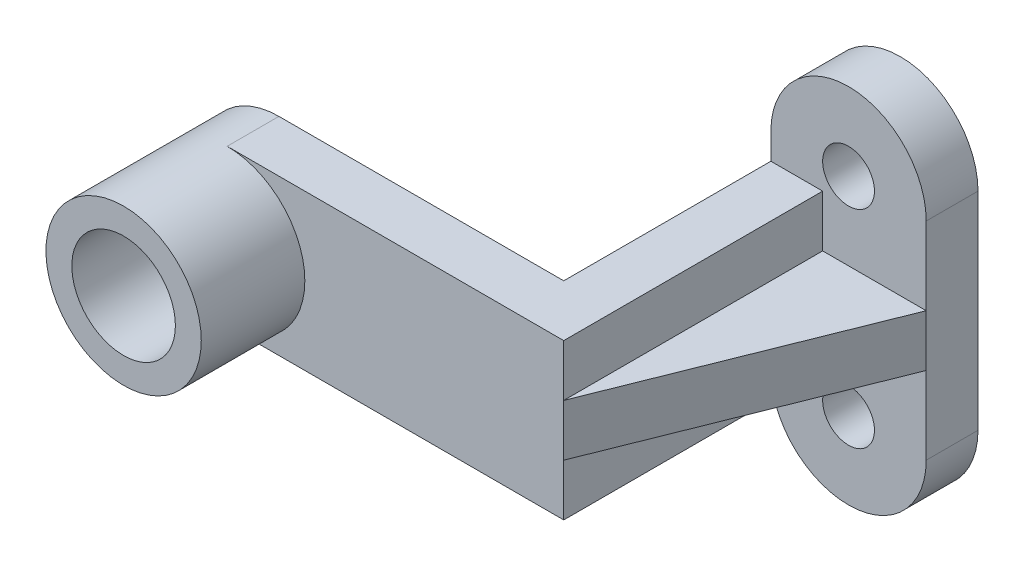
ISO-10303-21;
HEADER;
FILE_DESCRIPTION(('STEP AP214'),'2;1');
FILE_NAME('part.step','',(''),(''),'','','');
FILE_SCHEMA(('AUTOMOTIVE_DESIGN { 1 0 10303 214 1 1 1 1 }'));
ENDSEC;
DATA;
#1=APPLICATION_CONTEXT('core data for automotive mechanical design processes');
#2=APPLICATION_PROTOCOL_DEFINITION('international standard','automotive_design',2000,#1);
#3=PRODUCT_CONTEXT('',#1,'mechanical');
#4=PRODUCT('Part','Part','',(#3));
#5=PRODUCT_RELATED_PRODUCT_CATEGORY('part','',(#4));
#6=PRODUCT_DEFINITION_FORMATION('','',#4);
#7=PRODUCT_DEFINITION_CONTEXT('part definition',#1,'design');
#8=PRODUCT_DEFINITION('design','',#6,#7);
#9=PRODUCT_DEFINITION_SHAPE('','',#8);
#10=(LENGTH_UNIT() NAMED_UNIT(*) SI_UNIT(.MILLI.,.METRE.));
#11=(NAMED_UNIT(*) PLANE_ANGLE_UNIT() SI_UNIT($,.RADIAN.));
#12=(NAMED_UNIT(*) SI_UNIT($,.STERADIAN.) SOLID_ANGLE_UNIT());
#13=UNCERTAINTY_MEASURE_WITH_UNIT(LENGTH_MEASURE(1.E-05),#10,'distance_accuracy_value','');
#14=(GEOMETRIC_REPRESENTATION_CONTEXT(3) GLOBAL_UNCERTAINTY_ASSIGNED_CONTEXT((#13)) GLOBAL_UNIT_ASSIGNED_CONTEXT((#10,
#11,#12)) REPRESENTATION_CONTEXT('',''));
#15=CARTESIAN_POINT('',(0.,0.,0.));
#16=DIRECTION('',(0.,0.,1.));
#17=DIRECTION('',(1.,0.,0.));
#18=AXIS2_PLACEMENT_3D('',#15,#16,#17);
#19=CARTESIAN_POINT('',(0.,0.,60.));
#20=DIRECTION('',(0.,0.,-1.));
#21=DIRECTION('',(-1.,0.,0.));
#22=AXIS2_PLACEMENT_3D('',#19,#20,#21);
#23=PLANE('',#22);
#24=CARTESIAN_POINT('',(-70.,0.,60.));
#25=DIRECTION('',(0.,0.,1.));
#26=DIRECTION('',(1.,0.,0.));
#27=AXIS2_PLACEMENT_3D('',#24,#25,#26);
#28=CIRCLE('',#27,10.);
#29=CARTESIAN_POINT('',(-60.,0.,60.));
#30=VERTEX_POINT('',#29);
#31=EDGE_CURVE('E43',#30,#30,#28,.T.);
#32=ORIENTED_EDGE('',*,*,#31,.T.);
#33=EDGE_LOOP('',(#32));
#34=FACE_BOUND('',#33,.T.);
#35=ADVANCED_FACE('F33',(#34),#23,.F.);
#36=CARTESIAN_POINT('',(-15.,20.,10.));
#37=DIRECTION('',(1.,0.,0.));
#38=DIRECTION('',(0.,1.,0.));
#39=AXIS2_PLACEMENT_3D('',#36,#37,#38);
#40=PLANE('',#39);
#41=DIRECTION('',(0.,-1.,0.));
#42=VECTOR('',#41,1.);
#43=CARTESIAN_POINT('',(-15.,15.,50.));
#44=LINE('',#43,#42);
#45=CARTESIAN_POINT('',(-15.,15.,50.));
#46=VERTEX_POINT('',#45);
#47=CARTESIAN_POINT('',(-15.,-15.,50.));
#48=VERTEX_POINT('',#47);
#49=EDGE_CURVE('E165',#46,#48,#44,.T.);
#50=ORIENTED_EDGE('',*,*,#49,.F.);
#51=DIRECTION('',(0.,0.,-1.));
#52=VECTOR('',#51,1.);
#53=CARTESIAN_POINT('',(-15.,15.,60.));
#54=LINE('',#53,#52);
#55=CARTESIAN_POINT('',(-15.,15.,10.));
#56=VERTEX_POINT('',#55);
#57=EDGE_CURVE('E157',#46,#56,#54,.T.);
#58=ORIENTED_EDGE('',*,*,#57,.T.);
#59=DIRECTION('',(0.,-1.,0.));
#60=VECTOR('',#59,1.);
#61=CARTESIAN_POINT('',(-15.,20.,10.));
#62=LINE('',#61,#60);
#63=CARTESIAN_POINT('',(-15.,20.,10.));
#64=VERTEX_POINT('',#63);
#65=EDGE_CURVE('E85',#64,#56,#62,.T.);
#66=ORIENTED_EDGE('',*,*,#65,.F.);
#67=DIRECTION('',(0.,0.,-1.));
#68=VECTOR('',#67,1.);
#69=CARTESIAN_POINT('',(-15.,20.,10.));
#70=LINE('',#69,#68);
#71=CARTESIAN_POINT('',(-15.,20.,0.));
#72=VERTEX_POINT('',#71);
#73=EDGE_CURVE('E37',#64,#72,#70,.T.);
#74=ORIENTED_EDGE('',*,*,#73,.T.);
#75=DIRECTION('',(0.,-1.,0.));
#76=VECTOR('',#75,1.);
#77=CARTESIAN_POINT('',(-15.,20.,0.));
#78=LINE('',#77,#76);
#79=CARTESIAN_POINT('',(-15.,-20.,0.));
#80=VERTEX_POINT('',#79);
#81=EDGE_CURVE('E241',#72,#80,#78,.T.);
#82=ORIENTED_EDGE('',*,*,#81,.T.);
#83=DIRECTION('',(0.,0.,-1.));
#84=VECTOR('',#83,1.);
#85=CARTESIAN_POINT('',(-15.,-20.,10.));
#86=LINE('',#85,#84);
#87=CARTESIAN_POINT('',(-15.,-20.,10.));
#88=VERTEX_POINT('',#87);
#89=EDGE_CURVE('E247',#88,#80,#86,.T.);
#90=ORIENTED_EDGE('',*,*,#89,.F.);
#91=CARTESIAN_POINT('',(-15.,-15.,10.));
#92=VERTEX_POINT('',#91);
#93=EDGE_CURVE('E231',#92,#88,#62,.T.);
#94=ORIENTED_EDGE('',*,*,#93,.F.);
#95=DIRECTION('',(0.,0.,-1.));
#96=VECTOR('',#95,1.);
#97=CARTESIAN_POINT('',(-15.,-15.,60.));
#98=LINE('',#97,#96);
#99=EDGE_CURVE('E192',#48,#92,#98,.T.);
#100=ORIENTED_EDGE('',*,*,#99,.F.);
#101=EDGE_LOOP('',(#50,#58,#66,#74,#82,#90,#94,#100));
#102=FACE_BOUND('',#101,.T.);
#103=ADVANCED_FACE('F304',(#102),#40,.F.);
#104=CARTESIAN_POINT('',(0.,20.,10.));
#105=DIRECTION('',(0.,0.,1.));
#106=DIRECTION('',(1.,0.,0.));
#107=AXIS2_PLACEMENT_3D('',#104,#105,#106);
#108=PLANE('',#107);
#109=CARTESIAN_POINT('',(0.,-20.,10.));
#110=DIRECTION('',(0.,0.,1.));
#111=DIRECTION('',(1.,0.,0.));
#112=AXIS2_PLACEMENT_3D('',#109,#110,#111);
#113=CIRCLE('',#112,5.);
#114=CARTESIAN_POINT('',(5.00000000000001,-20.,10.));
#115=VERTEX_POINT('',#114);
#116=EDGE_CURVE('E223',#115,#115,#113,.T.);
#117=ORIENTED_EDGE('',*,*,#116,.F.);
#118=EDGE_LOOP('',(#117));
#119=FACE_BOUND('',#118,.T.);
#120=DIRECTION('',(0.,1.,0.));
#121=VECTOR('',#120,1.);
#122=CARTESIAN_POINT('',(-5.00000000000001,-15.,10.));
#123=LINE('',#122,#121);
#124=CARTESIAN_POINT('',(-5.00000000000001,-15.,10.));
#125=VERTEX_POINT('',#124);
#126=CARTESIAN_POINT('',(-5.00000000000001,-5.,10.));
#127=VERTEX_POINT('',#126);
#128=EDGE_CURVE('E183',#125,#127,#123,.T.);
#129=ORIENTED_EDGE('',*,*,#128,.F.);
#130=DIRECTION('',(1.,0.,0.));
#131=VECTOR('',#130,1.);
#132=CARTESIAN_POINT('',(-15.,-15.,10.));
#133=LINE('',#132,#131);
#134=EDGE_CURVE('E176',#92,#125,#133,.T.);
#135=ORIENTED_EDGE('',*,*,#134,.F.);
#136=ORIENTED_EDGE('',*,*,#93,.T.);
#137=CARTESIAN_POINT('',(0.,-20.,10.));
#138=DIRECTION('',(0.,0.,1.));
#139=DIRECTION('',(1.,0.,0.));
#140=AXIS2_PLACEMENT_3D('',#137,#138,#139);
#141=CIRCLE('',#140,15.);
#142=CARTESIAN_POINT('',(15.,-20.,10.));
#143=VERTEX_POINT('',#142);
#144=EDGE_CURVE('E233',#88,#143,#141,.T.);
#145=ORIENTED_EDGE('',*,*,#144,.T.);
#146=DIRECTION('',(0.,1.,0.));
#147=VECTOR('',#146,1.);
#148=CARTESIAN_POINT('',(15.,20.,10.));
#149=LINE('',#148,#147);
#150=CARTESIAN_POINT('',(15.,-5.,10.));
#151=VERTEX_POINT('',#150);
#152=EDGE_CURVE('E235',#143,#151,#149,.T.);
#153=ORIENTED_EDGE('',*,*,#152,.T.);
#154=DIRECTION('',(1.,0.,0.));
#155=VECTOR('',#154,1.);
#156=CARTESIAN_POINT('',(15.,-5.,10.));
#157=LINE('',#156,#155);
#158=EDGE_CURVE('E207',#127,#151,#157,.T.);
#159=ORIENTED_EDGE('',*,*,#158,.F.);
#160=EDGE_LOOP('',(#129,#135,#136,#145,#153,#159));
#161=FACE_BOUND('',#160,.T.);
#162=ADVANCED_FACE('F287',(#119,#161),#108,.T.);
#163=CARTESIAN_POINT('',(0.,20.,10.));
#164=DIRECTION('',(0.,0.,1.));
#165=DIRECTION('',(1.,0.,0.));
#166=AXIS2_PLACEMENT_3D('',#163,#164,#165);
#167=CIRCLE('',#166,5.);
#168=CARTESIAN_POINT('',(4.99999999999999,20.,10.));
#169=VERTEX_POINT('',#168);
#170=EDGE_CURVE('E217',#169,#169,#167,.T.);
#171=ORIENTED_EDGE('',*,*,#170,.F.);
#172=EDGE_LOOP('',(#171));
#173=FACE_BOUND('',#172,.T.);
#174=DIRECTION('',(-1.,0.,0.));
#175=VECTOR('',#174,1.);
#176=CARTESIAN_POINT('',(-15.,15.,10.));
#177=LINE('',#176,#175);
#178=CARTESIAN_POINT('',(-5.00000000000001,15.,10.));
#179=VERTEX_POINT('',#178);
#180=EDGE_CURVE('E179',#179,#56,#177,.T.);
#181=ORIENTED_EDGE('',*,*,#180,.F.);
#182=CARTESIAN_POINT('',(-5.00000000000001,4.99999999999999,10.));
#183=VERTEX_POINT('',#182);
#184=EDGE_CURVE('E182',#183,#179,#123,.T.);
#185=ORIENTED_EDGE('',*,*,#184,.F.);
#186=DIRECTION('',(-1.,0.,0.));
#187=VECTOR('',#186,1.);
#188=CARTESIAN_POINT('',(15.,5.,10.));
#189=LINE('',#188,#187);
#190=CARTESIAN_POINT('',(15.,5.,10.));
#191=VERTEX_POINT('',#190);
#192=EDGE_CURVE('E202',#191,#183,#189,.T.);
#193=ORIENTED_EDGE('',*,*,#192,.F.);
#194=CARTESIAN_POINT('',(15.,20.,10.));
#195=VERTEX_POINT('',#194);
#196=EDGE_CURVE('E52',#191,#195,#149,.T.);
#197=ORIENTED_EDGE('',*,*,#196,.T.);
#198=CARTESIAN_POINT('',(0.,20.,10.));
#199=DIRECTION('',(0.,0.,1.));
#200=DIRECTION('',(1.,0.,0.));
#201=AXIS2_PLACEMENT_3D('',#198,#199,#200);
#202=CIRCLE('',#201,15.);
#203=EDGE_CURVE('E229',#195,#64,#202,.T.);
#204=ORIENTED_EDGE('',*,*,#203,.T.);
#205=ORIENTED_EDGE('',*,*,#65,.T.);
#206=EDGE_LOOP('',(#181,#185,#193,#197,#204,#205));
#207=FACE_BOUND('',#206,.T.);
#208=ADVANCED_FACE('F295',(#173,#207),#108,.T.);
#209=CARTESIAN_POINT('',(0.,20.,0.));
#210=DIRECTION('',(0.,0.,1.));
#211=DIRECTION('',(1.,0.,0.));
#212=AXIS2_PLACEMENT_3D('',#209,#210,#211);
#213=PLANE('',#212);
#214=CARTESIAN_POINT('',(0.,20.,0.));
#215=DIRECTION('',(0.,0.,1.));
#216=DIRECTION('',(1.,0.,0.));
#217=AXIS2_PLACEMENT_3D('',#214,#215,#216);
#218=CIRCLE('',#217,15.);
#219=CARTESIAN_POINT('',(15.,20.,0.));
#220=VERTEX_POINT('',#219);
#221=EDGE_CURVE('E226',#220,#72,#218,.T.);
#222=ORIENTED_EDGE('',*,*,#221,.F.);
#223=DIRECTION('',(0.,1.,0.));
#224=VECTOR('',#223,1.);
#225=CARTESIAN_POINT('',(15.,20.,0.));
#226=LINE('',#225,#224);
#227=CARTESIAN_POINT('',(15.,-20.,0.));
#228=VERTEX_POINT('',#227);
#229=EDGE_CURVE('E77',#228,#220,#226,.T.);
#230=ORIENTED_EDGE('',*,*,#229,.F.);
#231=CARTESIAN_POINT('',(0.,-20.,0.));
#232=DIRECTION('',(0.,0.,1.));
#233=DIRECTION('',(1.,0.,0.));
#234=AXIS2_PLACEMENT_3D('',#231,#232,#233);
#235=CIRCLE('',#234,15.);
#236=EDGE_CURVE('E71',#80,#228,#235,.T.);
#237=ORIENTED_EDGE('',*,*,#236,.F.);
#238=ORIENTED_EDGE('',*,*,#81,.F.);
#239=EDGE_LOOP('',(#222,#230,#237,#238));
#240=FACE_BOUND('',#239,.T.);
#241=CARTESIAN_POINT('',(0.,-20.,0.));
#242=DIRECTION('',(0.,0.,1.));
#243=DIRECTION('',(1.,0.,0.));
#244=AXIS2_PLACEMENT_3D('',#241,#242,#243);
#245=CIRCLE('',#244,5.);
#246=CARTESIAN_POINT('',(5.00000000000001,-20.,0.));
#247=VERTEX_POINT('',#246);
#248=EDGE_CURVE('E220',#247,#247,#245,.T.);
#249=ORIENTED_EDGE('',*,*,#248,.T.);
#250=EDGE_LOOP('',(#249));
#251=FACE_BOUND('',#250,.T.);
#252=CARTESIAN_POINT('',(0.,20.,0.));
#253=DIRECTION('',(0.,0.,1.));
#254=DIRECTION('',(1.,0.,0.));
#255=AXIS2_PLACEMENT_3D('',#252,#253,#254);
#256=CIRCLE('',#255,5.);
#257=CARTESIAN_POINT('',(4.99999999999999,20.,0.));
#258=VERTEX_POINT('',#257);
#259=EDGE_CURVE('E216',#258,#258,#256,.T.);
#260=ORIENTED_EDGE('',*,*,#259,.T.);
#261=EDGE_LOOP('',(#260));
#262=FACE_BOUND('',#261,.T.);
#263=ADVANCED_FACE('F302',(#240,#251,#262),#213,.F.);
#264=CARTESIAN_POINT('',(0.,20.,10.));
#265=DIRECTION('',(0.,0.,-1.));
#266=DIRECTION('',(-1.,0.,0.));
#267=AXIS2_PLACEMENT_3D('',#264,#265,#266);
#268=CYLINDRICAL_SURFACE('',#267,15.);
#269=ORIENTED_EDGE('',*,*,#221,.T.);
#270=ORIENTED_EDGE('',*,*,#73,.F.);
#271=ORIENTED_EDGE('',*,*,#203,.F.);
#272=DIRECTION('',(0.,0.,-1.));
#273=VECTOR('',#272,1.);
#274=CARTESIAN_POINT('',(15.,20.,10.));
#275=LINE('',#274,#273);
#276=EDGE_CURVE('E238',#195,#220,#275,.T.);
#277=ORIENTED_EDGE('',*,*,#276,.T.);
#278=EDGE_LOOP('',(#269,#270,#271,#277));
#279=FACE_BOUND('',#278,.T.);
#280=ADVANCED_FACE('F35',(#279),#268,.T.);
#281=CARTESIAN_POINT('',(0.,-20.,10.));
#282=DIRECTION('',(0.,0.,-1.));
#283=DIRECTION('',(-1.,0.,0.));
#284=AXIS2_PLACEMENT_3D('',#281,#282,#283);
#285=CYLINDRICAL_SURFACE('',#284,15.);
#286=ORIENTED_EDGE('',*,*,#236,.T.);
#287=DIRECTION('',(0.,0.,-1.));
#288=VECTOR('',#287,1.);
#289=CARTESIAN_POINT('',(15.,-20.,10.));
#290=LINE('',#289,#288);
#291=EDGE_CURVE('E246',#143,#228,#290,.T.);
#292=ORIENTED_EDGE('',*,*,#291,.F.);
#293=ORIENTED_EDGE('',*,*,#144,.F.);
#294=ORIENTED_EDGE('',*,*,#89,.T.);
#295=EDGE_LOOP('',(#286,#292,#293,#294));
#296=FACE_BOUND('',#295,.T.);
#297=ADVANCED_FACE('F306',(#296),#285,.T.);
#298=CARTESIAN_POINT('',(15.,20.,10.));
#299=DIRECTION('',(-1.,0.,0.));
#300=DIRECTION('',(0.,-1.,0.));
#301=AXIS2_PLACEMENT_3D('',#298,#299,#300);
#302=PLANE('',#301);
#303=ORIENTED_EDGE('',*,*,#196,.F.);
#304=DIRECTION('',(0.,-1.,0.));
#305=VECTOR('',#304,1.);
#306=CARTESIAN_POINT('',(15.,45.,10.));
#307=LINE('',#306,#305);
#308=EDGE_CURVE('E196',#191,#151,#307,.T.);
#309=ORIENTED_EDGE('',*,*,#308,.T.);
#310=ORIENTED_EDGE('',*,*,#152,.F.);
#311=ORIENTED_EDGE('',*,*,#291,.T.);
#312=ORIENTED_EDGE('',*,*,#229,.T.);
#313=ORIENTED_EDGE('',*,*,#276,.F.);
#314=EDGE_LOOP('',(#303,#309,#310,#311,#312,#313));
#315=FACE_BOUND('',#314,.T.);
#316=ADVANCED_FACE('F290',(#315),#302,.F.);
#317=CARTESIAN_POINT('',(0.,-20.,10.));
#318=DIRECTION('',(0.,0.,-1.));
#319=DIRECTION('',(-1.,0.,0.));
#320=AXIS2_PLACEMENT_3D('',#317,#318,#319);
#321=CYLINDRICAL_SURFACE('',#320,5.);
#322=ORIENTED_EDGE('',*,*,#116,.T.);
#323=EDGE_LOOP('',(#322));
#324=FACE_BOUND('',#323,.T.);
#325=ORIENTED_EDGE('',*,*,#248,.F.);
#326=EDGE_LOOP('',(#325));
#327=FACE_BOUND('',#326,.T.);
#328=ADVANCED_FACE('F313',(#324,#327),#321,.F.);
#329=CARTESIAN_POINT('',(0.,20.,10.));
#330=DIRECTION('',(0.,0.,-1.));
#331=DIRECTION('',(-1.,0.,0.));
#332=AXIS2_PLACEMENT_3D('',#329,#330,#331);
#333=CYLINDRICAL_SURFACE('',#332,5.);
#334=ORIENTED_EDGE('',*,*,#170,.T.);
#335=EDGE_LOOP('',(#334));
#336=FACE_BOUND('',#335,.T.);
#337=ORIENTED_EDGE('',*,*,#259,.F.);
#338=EDGE_LOOP('',(#337));
#339=FACE_BOUND('',#338,.T.);
#340=ADVANCED_FACE('F341',(#336,#339),#333,.F.);
#341=CARTESIAN_POINT('',(15.,5.,60.));
#342=DIRECTION('',(0.,-1.,0.));
#343=DIRECTION('',(1.,0.,0.));
#344=AXIS2_PLACEMENT_3D('',#341,#342,#343);
#345=PLANE('',#344);
#346=DIRECTION('',(0.,0.,-1.));
#347=VECTOR('',#346,1.);
#348=CARTESIAN_POINT('',(-5.00000000000001,5.,60.));
#349=LINE('',#348,#347);
#350=CARTESIAN_POINT('',(-5.00000000000001,4.99999999999999,60.));
#351=VERTEX_POINT('',#350);
#352=EDGE_CURVE('E214',#351,#183,#349,.T.);
#353=ORIENTED_EDGE('',*,*,#352,.F.);
#354=DIRECTION('',(0.371390676354104,0.,-0.928476690885259));
#355=VECTOR('',#354,1.);
#356=CARTESIAN_POINT('',(-2.24137931034483,5.,53.1034482758621));
#357=LINE('',#356,#355);
#358=EDGE_CURVE('E199',#351,#191,#357,.T.);
#359=ORIENTED_EDGE('',*,*,#358,.T.);
#360=ORIENTED_EDGE('',*,*,#192,.T.);
#361=EDGE_LOOP('',(#353,#359,#360));
#362=FACE_BOUND('',#361,.T.);
#363=ADVANCED_FACE('F292',(#362),#345,.F.);
#364=CARTESIAN_POINT('',(15.,-5.,60.));
#365=DIRECTION('',(0.,1.,0.));
#366=DIRECTION('',(-1.,0.,0.));
#367=AXIS2_PLACEMENT_3D('',#364,#365,#366);
#368=PLANE('',#367);
#369=ORIENTED_EDGE('',*,*,#158,.T.);
#370=DIRECTION('',(0.371390676354104,0.,-0.928476690885259));
#371=VECTOR('',#370,1.);
#372=CARTESIAN_POINT('',(-5.00000000000001,-5.,60.));
#373=LINE('',#372,#371);
#374=CARTESIAN_POINT('',(-5.00000000000001,-5.,60.));
#375=VERTEX_POINT('',#374);
#376=EDGE_CURVE('E194',#375,#151,#373,.T.);
#377=ORIENTED_EDGE('',*,*,#376,.F.);
#378=DIRECTION('',(0.,0.,-1.));
#379=VECTOR('',#378,1.);
#380=CARTESIAN_POINT('',(-5.00000000000001,-5.,60.));
#381=LINE('',#380,#379);
#382=EDGE_CURVE('E206',#375,#127,#381,.T.);
#383=ORIENTED_EDGE('',*,*,#382,.T.);
#384=EDGE_LOOP('',(#369,#377,#383));
#385=FACE_BOUND('',#384,.T.);
#386=ADVANCED_FACE('F285',(#385),#368,.F.);
#387=CARTESIAN_POINT('',(-5.,45.,60.));
#388=DIRECTION('',(-0.928476690885259,0.,-0.371390676354104));
#389=DIRECTION('',(-0.371390676354104,0.,0.928476690885259));
#390=AXIS2_PLACEMENT_3D('',#387,#388,#389);
#391=PLANE('',#390);
#392=DIRECTION('',(0.,-1.,0.));
#393=VECTOR('',#392,1.);
#394=CARTESIAN_POINT('',(-5.00000000000001,5.,60.));
#395=LINE('',#394,#393);
#396=EDGE_CURVE('E203',#351,#375,#395,.T.);
#397=ORIENTED_EDGE('',*,*,#396,.T.);
#398=ORIENTED_EDGE('',*,*,#376,.T.);
#399=ORIENTED_EDGE('',*,*,#308,.F.);
#400=ORIENTED_EDGE('',*,*,#358,.F.);
#401=EDGE_LOOP('',(#397,#398,#399,#400));
#402=FACE_BOUND('',#401,.T.);
#403=ADVANCED_FACE('F283',(#402),#391,.F.);
#404=CARTESIAN_POINT('',(-5.00000000000001,-15.,60.));
#405=DIRECTION('',(-1.,0.,0.));
#406=DIRECTION('',(0.,0.,1.));
#407=AXIS2_PLACEMENT_3D('',#404,#405,#406);
#408=PLANE('',#407);
#409=DIRECTION('',(0.,1.,0.));
#410=VECTOR('',#409,1.);
#411=CARTESIAN_POINT('',(-5.00000000000001,-15.,60.));
#412=LINE('',#411,#410);
#413=CARTESIAN_POINT('',(-5.00000000000001,15.,60.));
#414=VERTEX_POINT('',#413);
#415=EDGE_CURVE('E153',#351,#414,#412,.T.);
#416=ORIENTED_EDGE('',*,*,#415,.F.);
#417=ORIENTED_EDGE('',*,*,#352,.T.);
#418=ORIENTED_EDGE('',*,*,#184,.T.);
#419=DIRECTION('',(0.,0.,-1.));
#420=VECTOR('',#419,1.);
#421=CARTESIAN_POINT('',(-5.00000000000001,15.,60.));
#422=LINE('',#421,#420);
#423=EDGE_CURVE('E187',#414,#179,#422,.T.);
#424=ORIENTED_EDGE('',*,*,#423,.F.);
#425=EDGE_LOOP('',(#416,#417,#418,#424));
#426=FACE_BOUND('',#425,.T.);
#427=ADVANCED_FACE('F297',(#426),#408,.F.);
#428=ORIENTED_EDGE('',*,*,#128,.T.);
#429=ORIENTED_EDGE('',*,*,#382,.F.);
#430=CARTESIAN_POINT('',(-5.00000000000001,-15.,60.));
#431=VERTEX_POINT('',#430);
#432=EDGE_CURVE('E158',#431,#375,#412,.T.);
#433=ORIENTED_EDGE('',*,*,#432,.F.);
#434=DIRECTION('',(0.,0.,-1.));
#435=VECTOR('',#434,1.);
#436=CARTESIAN_POINT('',(-5.00000000000001,-15.,60.));
#437=LINE('',#436,#435);
#438=EDGE_CURVE('E189',#431,#125,#437,.T.);
#439=ORIENTED_EDGE('',*,*,#438,.T.);
#440=EDGE_LOOP('',(#428,#429,#433,#439));
#441=FACE_BOUND('',#440,.T.);
#442=ADVANCED_FACE('F277',(#441),#408,.F.);
#443=CARTESIAN_POINT('',(-15.,-15.,60.));
#444=DIRECTION('',(0.,1.,0.));
#445=DIRECTION('',(-1.,0.,0.));
#446=AXIS2_PLACEMENT_3D('',#443,#444,#445);
#447=PLANE('',#446);
#448=ORIENTED_EDGE('',*,*,#134,.T.);
#449=ORIENTED_EDGE('',*,*,#438,.F.);
#450=DIRECTION('',(1.,0.,0.));
#451=VECTOR('',#450,1.);
#452=CARTESIAN_POINT('',(-15.,-15.,60.));
#453=LINE('',#452,#451);
#454=CARTESIAN_POINT('',(-70.,-15.,60.));
#455=VERTEX_POINT('',#454);
#456=EDGE_CURVE('E177',#455,#431,#453,.T.);
#457=ORIENTED_EDGE('',*,*,#456,.F.);
#458=DIRECTION('',(0.,0.,1.));
#459=VECTOR('',#458,1.);
#460=CARTESIAN_POINT('',(-70.,-15.,60.));
#461=LINE('',#460,#459);
#462=CARTESIAN_POINT('',(-70.,-15.,50.));
#463=VERTEX_POINT('',#462);
#464=EDGE_CURVE('E146',#463,#455,#461,.T.);
#465=ORIENTED_EDGE('',*,*,#464,.F.);
#466=DIRECTION('',(1.,0.,0.));
#467=VECTOR('',#466,1.);
#468=CARTESIAN_POINT('',(-70.,-15.,50.));
#469=LINE('',#468,#467);
#470=EDGE_CURVE('E167',#463,#48,#469,.T.);
#471=ORIENTED_EDGE('',*,*,#470,.T.);
#472=ORIENTED_EDGE('',*,*,#99,.T.);
#473=EDGE_LOOP('',(#448,#449,#457,#465,#471,#472));
#474=FACE_BOUND('',#473,.T.);
#475=ADVANCED_FACE('F271',(#474),#447,.F.);
#476=CARTESIAN_POINT('',(-15.,15.,60.));
#477=DIRECTION('',(0.,-1.,0.));
#478=DIRECTION('',(1.,0.,0.));
#479=AXIS2_PLACEMENT_3D('',#476,#477,#478);
#480=PLANE('',#479);
#481=ORIENTED_EDGE('',*,*,#180,.T.);
#482=ORIENTED_EDGE('',*,*,#57,.F.);
#483=DIRECTION('',(1.,0.,0.));
#484=VECTOR('',#483,1.);
#485=CARTESIAN_POINT('',(-70.,15.,50.));
#486=LINE('',#485,#484);
#487=CARTESIAN_POINT('',(-70.,15.,50.));
#488=VERTEX_POINT('',#487);
#489=EDGE_CURVE('E164',#488,#46,#486,.T.);
#490=ORIENTED_EDGE('',*,*,#489,.F.);
#491=DIRECTION('',(0.,0.,-1.));
#492=VECTOR('',#491,1.);
#493=CARTESIAN_POINT('',(-70.,15.,60.));
#494=LINE('',#493,#492);
#495=CARTESIAN_POINT('',(-70.,15.,60.));
#496=VERTEX_POINT('',#495);
#497=EDGE_CURVE('E143',#496,#488,#494,.T.);
#498=ORIENTED_EDGE('',*,*,#497,.F.);
#499=DIRECTION('',(-1.,0.,0.));
#500=VECTOR('',#499,1.);
#501=CARTESIAN_POINT('',(-15.,15.,60.));
#502=LINE('',#501,#500);
#503=EDGE_CURVE('E150',#414,#496,#502,.T.);
#504=ORIENTED_EDGE('',*,*,#503,.F.);
#505=ORIENTED_EDGE('',*,*,#423,.T.);
#506=EDGE_LOOP('',(#481,#482,#490,#498,#504,#505));
#507=FACE_BOUND('',#506,.T.);
#508=ADVANCED_FACE('F162',(#507),#480,.F.);
#509=CARTESIAN_POINT('',(-70.,0.,60.));
#510=DIRECTION('',(0.,0.,1.));
#511=DIRECTION('',(1.,0.,0.));
#512=AXIS2_PLACEMENT_3D('',#509,#510,#511);
#513=CIRCLE('',#512,15.);
#514=EDGE_CURVE('E11',#455,#496,#513,.T.);
#515=ORIENTED_EDGE('',*,*,#514,.F.);
#516=ORIENTED_EDGE('',*,*,#456,.T.);
#517=ORIENTED_EDGE('',*,*,#432,.T.);
#518=ORIENTED_EDGE('',*,*,#396,.F.);
#519=ORIENTED_EDGE('',*,*,#415,.T.);
#520=ORIENTED_EDGE('',*,*,#503,.T.);
#521=EDGE_LOOP('',(#515,#516,#517,#518,#519,#520));
#522=FACE_BOUND('',#521,.T.);
#523=ADVANCED_FACE('F151',(#522),#23,.F.);
#524=CARTESIAN_POINT('',(-70.,15.,50.));
#525=DIRECTION('',(0.,0.,1.));
#526=DIRECTION('',(1.,0.,0.));
#527=AXIS2_PLACEMENT_3D('',#524,#525,#526);
#528=PLANE('',#527);
#529=ORIENTED_EDGE('',*,*,#470,.F.);
#530=CARTESIAN_POINT('',(-70.,0.,50.));
#531=DIRECTION('',(0.,0.,-1.));
#532=DIRECTION('',(-1.,0.,0.));
#533=AXIS2_PLACEMENT_3D('',#530,#531,#532);
#534=CIRCLE('',#533,15.);
#535=EDGE_CURVE('E262',#463,#488,#534,.T.);
#536=ORIENTED_EDGE('',*,*,#535,.T.);
#537=ORIENTED_EDGE('',*,*,#489,.T.);
#538=ORIENTED_EDGE('',*,*,#49,.T.);
#539=EDGE_LOOP('',(#529,#536,#537,#538));
#540=FACE_BOUND('',#539,.T.);
#541=ADVANCED_FACE('F267',(#540),#528,.F.);
#542=CARTESIAN_POINT('',(-70.,0.,80.));
#543=DIRECTION('',(0.,0.,1.));
#544=DIRECTION('',(1.,0.,0.));
#545=AXIS2_PLACEMENT_3D('',#542,#543,#544);
#546=PLANE('',#545);
#547=CARTESIAN_POINT('',(-70.,0.,80.));
#548=DIRECTION('',(0.,0.,1.));
#549=DIRECTION('',(1.,0.,0.));
#550=AXIS2_PLACEMENT_3D('',#547,#548,#549);
#551=CIRCLE('',#550,15.);
#552=CARTESIAN_POINT('',(-55.,0.,80.));
#553=VERTEX_POINT('',#552);
#554=EDGE_CURVE('E169',#553,#553,#551,.T.);
#555=ORIENTED_EDGE('',*,*,#554,.T.);
#556=EDGE_LOOP('',(#555));
#557=FACE_BOUND('',#556,.T.);
#558=CARTESIAN_POINT('',(-70.,0.,80.));
#559=DIRECTION('',(0.,0.,1.));
#560=DIRECTION('',(1.,0.,0.));
#561=AXIS2_PLACEMENT_3D('',#558,#559,#560);
#562=CIRCLE('',#561,10.);
#563=CARTESIAN_POINT('',(-60.,0.,80.));
#564=VERTEX_POINT('',#563);
#565=EDGE_CURVE('E256',#564,#564,#562,.T.);
#566=ORIENTED_EDGE('',*,*,#565,.F.);
#567=EDGE_LOOP('',(#566));
#568=FACE_BOUND('',#567,.T.);
#569=ADVANCED_FACE('F327',(#557,#568),#546,.T.);
#570=CARTESIAN_POINT('',(-70.,0.,80.));
#571=DIRECTION('',(0.,0.,-1.));
#572=DIRECTION('',(-1.,0.,0.));
#573=AXIS2_PLACEMENT_3D('',#570,#571,#572);
#574=CYLINDRICAL_SURFACE('',#573,15.);
#575=ORIENTED_EDGE('',*,*,#554,.F.);
#576=EDGE_LOOP('',(#575));
#577=FACE_BOUND('',#576,.T.);
#578=ORIENTED_EDGE('',*,*,#514,.T.);
#579=ORIENTED_EDGE('',*,*,#497,.T.);
#580=ORIENTED_EDGE('',*,*,#535,.F.);
#581=ORIENTED_EDGE('',*,*,#464,.T.);
#582=EDGE_LOOP('',(#578,#579,#580,#581));
#583=FACE_BOUND('',#582,.T.);
#584=ADVANCED_FACE('F141',(#577,#583),#574,.T.);
#585=CARTESIAN_POINT('',(-70.,0.,80.));
#586=DIRECTION('',(0.,0.,-1.));
#587=DIRECTION('',(-1.,0.,0.));
#588=AXIS2_PLACEMENT_3D('',#585,#586,#587);
#589=CYLINDRICAL_SURFACE('',#588,10.);
#590=ORIENTED_EDGE('',*,*,#565,.T.);
#591=EDGE_LOOP('',(#590));
#592=FACE_BOUND('',#591,.T.);
#593=ORIENTED_EDGE('',*,*,#31,.F.);
#594=EDGE_LOOP('',(#593));
#595=FACE_BOUND('',#594,.T.);
#596=ADVANCED_FACE('F426',(#592,#595),#589,.F.);
#597=CLOSED_SHELL('',(#35,#103,#162,#208,#263,#280,#297,#316,#328,#340,#363,#386,#403,#427,#442,
#475,#508,#523,#541,#569,#584,#596));
#598=MANIFOLD_SOLID_BREP('B2',#597);
#599=ADVANCED_BREP_SHAPE_REPRESENTATION('',(#18,#598),#14);
#600=SHAPE_DEFINITION_REPRESENTATION(#9,#599);
ENDSEC;
END-ISO-10303-21;
